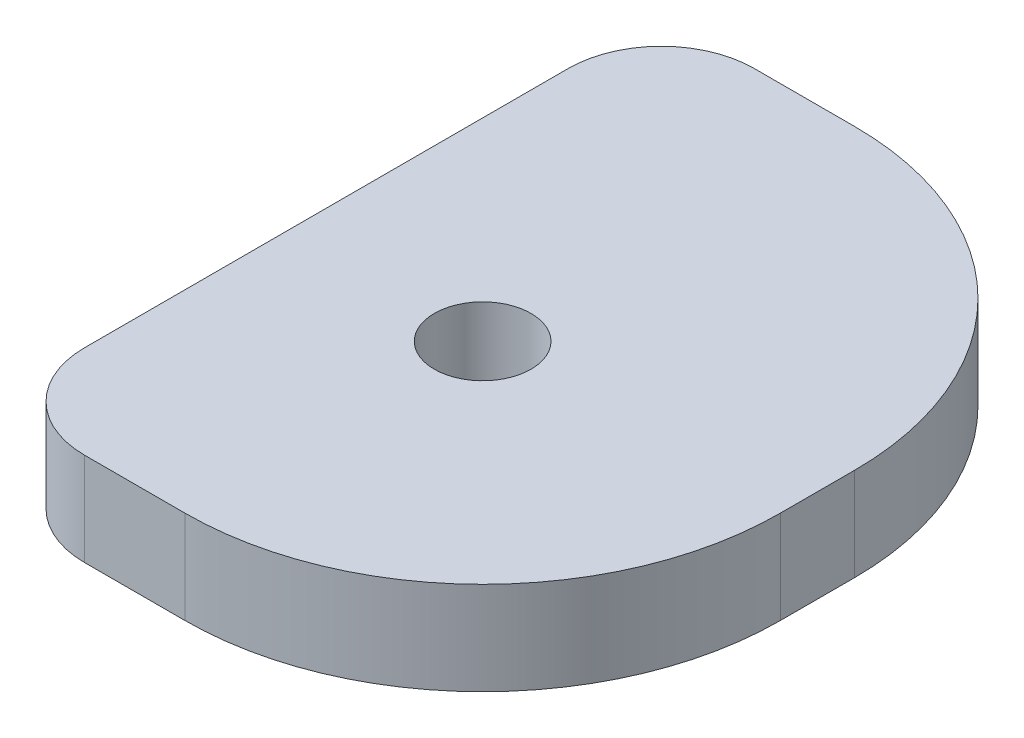
ISO-10303-21;
HEADER;
FILE_DESCRIPTION(('STEP AP214'),'2;1');
FILE_NAME('part.step','',(''),(''),'','','');
FILE_SCHEMA(('AUTOMOTIVE_DESIGN { 1 0 10303 214 1 1 1 1 }'));
ENDSEC;
DATA;
#1=APPLICATION_CONTEXT('core data for automotive mechanical design processes');
#2=APPLICATION_PROTOCOL_DEFINITION('international standard','automotive_design',2000,#1);
#3=PRODUCT_CONTEXT('',#1,'mechanical');
#4=PRODUCT('Part','Part','',(#3));
#5=PRODUCT_RELATED_PRODUCT_CATEGORY('part','',(#4));
#6=PRODUCT_DEFINITION_FORMATION('','',#4);
#7=PRODUCT_DEFINITION_CONTEXT('part definition',#1,'design');
#8=PRODUCT_DEFINITION('design','',#6,#7);
#9=PRODUCT_DEFINITION_SHAPE('','',#8);
#10=(LENGTH_UNIT() NAMED_UNIT(*) SI_UNIT(.MILLI.,.METRE.));
#11=(NAMED_UNIT(*) PLANE_ANGLE_UNIT() SI_UNIT($,.RADIAN.));
#12=(NAMED_UNIT(*) SI_UNIT($,.STERADIAN.) SOLID_ANGLE_UNIT());
#13=UNCERTAINTY_MEASURE_WITH_UNIT(LENGTH_MEASURE(1.E-05),#10,'distance_accuracy_value','');
#14=(GEOMETRIC_REPRESENTATION_CONTEXT(3) GLOBAL_UNCERTAINTY_ASSIGNED_CONTEXT((#13)) GLOBAL_UNIT_ASSIGNED_CONTEXT((#10,
#11,#12)) REPRESENTATION_CONTEXT('',''));
#15=CARTESIAN_POINT('',(0.,0.,0.));
#16=DIRECTION('',(0.,0.,1.));
#17=DIRECTION('',(1.,0.,0.));
#18=AXIS2_PLACEMENT_3D('',#15,#16,#17);
#19=CARTESIAN_POINT('',(-25.4,3.175,11.43));
#20=DIRECTION('',(0.,0.,-1.));
#21=DIRECTION('',(-1.,0.,0.));
#22=AXIS2_PLACEMENT_3D('',#19,#20,#21);
#23=PLANE('',#22);
#24=DIRECTION('',(1.,0.,0.));
#25=VECTOR('',#24,1.);
#26=CARTESIAN_POINT('',(-25.4,3.175,11.43));
#27=LINE('',#26,#25);
#28=CARTESIAN_POINT('',(11.811,3.175,11.43));
#29=VERTEX_POINT('',#28);
#30=CARTESIAN_POINT('',(15.24,3.175,11.43));
#31=VERTEX_POINT('',#30);
#32=EDGE_CURVE('E156',#29,#31,#27,.T.);
#33=ORIENTED_EDGE('',*,*,#32,.F.);
#34=DIRECTION('',(0.,-1.,0.));
#35=VECTOR('',#34,1.);
#36=CARTESIAN_POINT('',(11.811,3.175,11.43));
#37=LINE('',#36,#35);
#38=CARTESIAN_POINT('',(11.811,0.,11.43));
#39=VERTEX_POINT('',#38);
#40=EDGE_CURVE('E107',#29,#39,#37,.T.);
#41=ORIENTED_EDGE('',*,*,#40,.T.);
#42=DIRECTION('',(1.,0.,0.));
#43=VECTOR('',#42,1.);
#44=CARTESIAN_POINT('',(-25.4,0.,11.43));
#45=LINE('',#44,#43);
#46=CARTESIAN_POINT('',(15.24,0.,11.43));
#47=VERTEX_POINT('',#46);
#48=EDGE_CURVE('E100',#39,#47,#45,.T.);
#49=ORIENTED_EDGE('',*,*,#48,.T.);
#50=DIRECTION('',(0.,-1.,0.));
#51=VECTOR('',#50,1.);
#52=CARTESIAN_POINT('',(15.24,3.175,11.43));
#53=LINE('',#52,#51);
#54=EDGE_CURVE('E104',#47,#31,#53,.F.);
#55=ORIENTED_EDGE('',*,*,#54,.T.);
#56=EDGE_LOOP('',(#33,#41,#49,#55));
#57=FACE_BOUND('',#56,.T.);
#58=ADVANCED_FACE('F32',(#57),#23,.F.);
#59=CARTESIAN_POINT('',(25.4,3.175,-11.43));
#60=DIRECTION('',(-1.,0.,0.));
#61=DIRECTION('',(0.,0.,1.));
#62=AXIS2_PLACEMENT_3D('',#59,#60,#61);
#63=PLANE('',#62);
#64=DIRECTION('',(0.,0.,-1.));
#65=VECTOR('',#64,1.);
#66=CARTESIAN_POINT('',(25.4,0.,-11.43));
#67=LINE('',#66,#65);
#68=CARTESIAN_POINT('',(25.4,0.,1.27));
#69=VERTEX_POINT('',#68);
#70=CARTESIAN_POINT('',(25.4,0.,-1.27));
#71=VERTEX_POINT('',#70);
#72=EDGE_CURVE('E109',#69,#71,#67,.T.);
#73=ORIENTED_EDGE('',*,*,#72,.T.);
#74=DIRECTION('',(0.,-1.,0.));
#75=VECTOR('',#74,1.);
#76=CARTESIAN_POINT('',(25.4,3.175,-1.27));
#77=LINE('',#76,#75);
#78=CARTESIAN_POINT('',(25.4,3.175,-1.27));
#79=VERTEX_POINT('',#78);
#80=EDGE_CURVE('E140',#71,#79,#77,.F.);
#81=ORIENTED_EDGE('',*,*,#80,.T.);
#82=DIRECTION('',(0.,0.,-1.));
#83=VECTOR('',#82,1.);
#84=CARTESIAN_POINT('',(25.4,3.175,-11.43));
#85=LINE('',#84,#83);
#86=CARTESIAN_POINT('',(25.4,3.175,1.27));
#87=VERTEX_POINT('',#86);
#88=EDGE_CURVE('E124',#87,#79,#85,.T.);
#89=ORIENTED_EDGE('',*,*,#88,.F.);
#90=DIRECTION('',(0.,-1.,0.));
#91=VECTOR('',#90,1.);
#92=CARTESIAN_POINT('',(25.4,3.175,1.27));
#93=LINE('',#92,#91);
#94=EDGE_CURVE('E131',#87,#69,#93,.T.);
#95=ORIENTED_EDGE('',*,*,#94,.T.);
#96=EDGE_LOOP('',(#73,#81,#89,#95));
#97=FACE_BOUND('',#96,.T.);
#98=ADVANCED_FACE('F185',(#97),#63,.F.);
#99=CARTESIAN_POINT('',(-25.4,3.175,-11.43));
#100=DIRECTION('',(0.,0.,1.));
#101=DIRECTION('',(1.,0.,0.));
#102=AXIS2_PLACEMENT_3D('',#99,#100,#101);
#103=PLANE('',#102);
#104=DIRECTION('',(-1.,0.,0.));
#105=VECTOR('',#104,1.);
#106=CARTESIAN_POINT('',(-25.4,0.,-11.43));
#107=LINE('',#106,#105);
#108=CARTESIAN_POINT('',(15.24,0.,-11.43));
#109=VERTEX_POINT('',#108);
#110=CARTESIAN_POINT('',(11.811,0.,-11.43));
#111=VERTEX_POINT('',#110);
#112=EDGE_CURVE('E127',#109,#111,#107,.T.);
#113=ORIENTED_EDGE('',*,*,#112,.T.);
#114=DIRECTION('',(0.,-1.,0.));
#115=VECTOR('',#114,1.);
#116=CARTESIAN_POINT('',(11.811,3.175,-11.43));
#117=LINE('',#116,#115);
#118=CARTESIAN_POINT('',(11.811,3.175,-11.43));
#119=VERTEX_POINT('',#118);
#120=EDGE_CURVE('E11',#111,#119,#117,.F.);
#121=ORIENTED_EDGE('',*,*,#120,.T.);
#122=DIRECTION('',(-1.,0.,0.));
#123=VECTOR('',#122,1.);
#124=CARTESIAN_POINT('',(-25.4,3.175,-11.43));
#125=LINE('',#124,#123);
#126=CARTESIAN_POINT('',(15.24,3.175,-11.43));
#127=VERTEX_POINT('',#126);
#128=EDGE_CURVE('E122',#127,#119,#125,.T.);
#129=ORIENTED_EDGE('',*,*,#128,.F.);
#130=DIRECTION('',(0.,-1.,0.));
#131=VECTOR('',#130,1.);
#132=CARTESIAN_POINT('',(15.24,3.175,-11.43));
#133=LINE('',#132,#131);
#134=EDGE_CURVE('E135',#127,#109,#133,.T.);
#135=ORIENTED_EDGE('',*,*,#134,.T.);
#136=EDGE_LOOP('',(#113,#121,#129,#135));
#137=FACE_BOUND('',#136,.T.);
#138=ADVANCED_FACE('F177',(#137),#103,.F.);
#139=CARTESIAN_POINT('',(0.,3.175,0.));
#140=DIRECTION('',(0.,1.,0.));
#141=DIRECTION('',(0.,0.,1.));
#142=AXIS2_PLACEMENT_3D('',#139,#140,#141);
#143=PLANE('',#142);
#144=DIRECTION('',(0.,0.,1.));
#145=VECTOR('',#144,1.);
#146=CARTESIAN_POINT('',(8.63599999999999,3.175,11.43));
#147=LINE('',#146,#145);
#148=CARTESIAN_POINT('',(8.63599999999999,3.175,-8.255));
#149=VERTEX_POINT('',#148);
#150=CARTESIAN_POINT('',(8.63599999999999,3.175,8.255));
#151=VERTEX_POINT('',#150);
#152=EDGE_CURVE('E157',#149,#151,#147,.T.);
#153=ORIENTED_EDGE('',*,*,#152,.T.);
#154=CARTESIAN_POINT('',(11.811,3.175,8.255));
#155=DIRECTION('',(0.,1.,0.));
#156=DIRECTION('',(0.,0.,1.));
#157=AXIS2_PLACEMENT_3D('',#154,#155,#156);
#158=CIRCLE('',#157,3.175);
#159=EDGE_CURVE('E40',#151,#29,#158,.T.);
#160=ORIENTED_EDGE('',*,*,#159,.T.);
#161=ORIENTED_EDGE('',*,*,#32,.T.);
#162=CARTESIAN_POINT('',(15.24,3.175,1.27));
#163=DIRECTION('',(0.,1.,0.));
#164=DIRECTION('',(0.,0.,1.));
#165=AXIS2_PLACEMENT_3D('',#162,#163,#164);
#166=CIRCLE('',#165,10.16);
#167=EDGE_CURVE('E119',#31,#87,#166,.T.);
#168=ORIENTED_EDGE('',*,*,#167,.T.);
#169=ORIENTED_EDGE('',*,*,#88,.T.);
#170=CARTESIAN_POINT('',(15.24,3.175,-1.27));
#171=DIRECTION('',(0.,1.,0.));
#172=DIRECTION('',(0.,0.,1.));
#173=AXIS2_PLACEMENT_3D('',#170,#171,#172);
#174=CIRCLE('',#173,10.16);
#175=EDGE_CURVE('E138',#79,#127,#174,.T.);
#176=ORIENTED_EDGE('',*,*,#175,.T.);
#177=ORIENTED_EDGE('',*,*,#128,.T.);
#178=CARTESIAN_POINT('',(11.811,3.175,-8.255));
#179=DIRECTION('',(0.,1.,0.));
#180=DIRECTION('',(0.,0.,1.));
#181=AXIS2_PLACEMENT_3D('',#178,#179,#180);
#182=CIRCLE('',#181,3.175);
#183=EDGE_CURVE('E151',#119,#149,#182,.T.);
#184=ORIENTED_EDGE('',*,*,#183,.T.);
#185=EDGE_LOOP('',(#153,#160,#161,#168,#169,#176,#177,#184));
#186=FACE_BOUND('',#185,.T.);
#187=CARTESIAN_POINT('',(15.24,3.175,1.27));
#188=DIRECTION('',(0.,1.,0.));
#189=DIRECTION('',(0.,0.,1.));
#190=AXIS2_PLACEMENT_3D('',#187,#188,#189);
#191=CIRCLE('',#190,1.651);
#192=CARTESIAN_POINT('',(15.24,3.175,2.921));
#193=VERTEX_POINT('',#192);
#194=EDGE_CURVE('E166',#193,#193,#191,.T.);
#195=ORIENTED_EDGE('',*,*,#194,.F.);
#196=EDGE_LOOP('',(#195));
#197=FACE_BOUND('',#196,.T.);
#198=ADVANCED_FACE('F154',(#186,#197),#143,.T.);
#199=CARTESIAN_POINT('',(0.,0.,0.));
#200=DIRECTION('',(0.,1.,0.));
#201=DIRECTION('',(0.,0.,1.));
#202=AXIS2_PLACEMENT_3D('',#199,#200,#201);
#203=PLANE('',#202);
#204=CARTESIAN_POINT('',(15.24,0.,1.27));
#205=DIRECTION('',(0.,1.,0.));
#206=DIRECTION('',(0.,0.,1.));
#207=AXIS2_PLACEMENT_3D('',#204,#205,#206);
#208=CIRCLE('',#207,1.651);
#209=CARTESIAN_POINT('',(15.24,0.,2.921));
#210=VERTEX_POINT('',#209);
#211=EDGE_CURVE('E110',#210,#210,#208,.T.);
#212=ORIENTED_EDGE('',*,*,#211,.T.);
#213=EDGE_LOOP('',(#212));
#214=FACE_BOUND('',#213,.T.);
#215=ORIENTED_EDGE('',*,*,#48,.F.);
#216=CARTESIAN_POINT('',(11.811,0.,8.255));
#217=DIRECTION('',(0.,1.,0.));
#218=DIRECTION('',(0.,0.,1.));
#219=AXIS2_PLACEMENT_3D('',#216,#217,#218);
#220=CIRCLE('',#219,3.175);
#221=CARTESIAN_POINT('',(8.63599999999999,0.,8.255));
#222=VERTEX_POINT('',#221);
#223=EDGE_CURVE('E145',#39,#222,#220,.F.);
#224=ORIENTED_EDGE('',*,*,#223,.T.);
#225=DIRECTION('',(0.,0.,1.));
#226=VECTOR('',#225,1.);
#227=CARTESIAN_POINT('',(8.63599999999999,0.,11.43));
#228=LINE('',#227,#226);
#229=CARTESIAN_POINT('',(8.63599999999999,0.,-8.255));
#230=VERTEX_POINT('',#229);
#231=EDGE_CURVE('E162',#230,#222,#228,.T.);
#232=ORIENTED_EDGE('',*,*,#231,.F.);
#233=CARTESIAN_POINT('',(11.811,0.,-8.255));
#234=DIRECTION('',(0.,1.,0.));
#235=DIRECTION('',(0.,0.,1.));
#236=AXIS2_PLACEMENT_3D('',#233,#234,#235);
#237=CIRCLE('',#236,3.175);
#238=EDGE_CURVE('E143',#230,#111,#237,.F.);
#239=ORIENTED_EDGE('',*,*,#238,.T.);
#240=ORIENTED_EDGE('',*,*,#112,.F.);
#241=CARTESIAN_POINT('',(15.24,0.,-1.27));
#242=DIRECTION('',(0.,1.,0.));
#243=DIRECTION('',(0.,0.,1.));
#244=AXIS2_PLACEMENT_3D('',#241,#242,#243);
#245=CIRCLE('',#244,10.16);
#246=EDGE_CURVE('E133',#109,#71,#245,.F.);
#247=ORIENTED_EDGE('',*,*,#246,.T.);
#248=ORIENTED_EDGE('',*,*,#72,.F.);
#249=CARTESIAN_POINT('',(15.24,0.,1.27));
#250=DIRECTION('',(0.,1.,0.));
#251=DIRECTION('',(0.,0.,1.));
#252=AXIS2_PLACEMENT_3D('',#249,#250,#251);
#253=CIRCLE('',#252,10.16);
#254=EDGE_CURVE('E113',#69,#47,#253,.F.);
#255=ORIENTED_EDGE('',*,*,#254,.T.);
#256=EDGE_LOOP('',(#215,#224,#232,#239,#240,#247,#248,#255));
#257=FACE_BOUND('',#256,.T.);
#258=ADVANCED_FACE('F114',(#214,#257),#203,.F.);
#259=CARTESIAN_POINT('',(15.24,3.175,1.27));
#260=DIRECTION('',(0.,-1.,0.));
#261=DIRECTION('',(0.,0.,-1.));
#262=AXIS2_PLACEMENT_3D('',#259,#260,#261);
#263=CYLINDRICAL_SURFACE('',#262,10.16);
#264=ORIENTED_EDGE('',*,*,#167,.F.);
#265=ORIENTED_EDGE('',*,*,#54,.F.);
#266=ORIENTED_EDGE('',*,*,#254,.F.);
#267=ORIENTED_EDGE('',*,*,#94,.F.);
#268=EDGE_LOOP('',(#264,#265,#266,#267));
#269=FACE_BOUND('',#268,.T.);
#270=ADVANCED_FACE('F121',(#269),#263,.T.);
#271=CARTESIAN_POINT('',(15.24,0.,1.27));
#272=DIRECTION('',(0.,1.,0.));
#273=DIRECTION('',(0.,0.,1.));
#274=AXIS2_PLACEMENT_3D('',#271,#272,#273);
#275=CYLINDRICAL_SURFACE('',#274,1.651);
#276=ORIENTED_EDGE('',*,*,#211,.F.);
#277=EDGE_LOOP('',(#276));
#278=FACE_BOUND('',#277,.T.);
#279=ORIENTED_EDGE('',*,*,#194,.T.);
#280=EDGE_LOOP('',(#279));
#281=FACE_BOUND('',#280,.T.);
#282=ADVANCED_FACE('F198',(#278,#281),#275,.F.);
#283=CARTESIAN_POINT('',(15.24,3.175,-1.27));
#284=DIRECTION('',(0.,-1.,0.));
#285=DIRECTION('',(0.,0.,-1.));
#286=AXIS2_PLACEMENT_3D('',#283,#284,#285);
#287=CYLINDRICAL_SURFACE('',#286,10.16);
#288=ORIENTED_EDGE('',*,*,#175,.F.);
#289=ORIENTED_EDGE('',*,*,#80,.F.);
#290=ORIENTED_EDGE('',*,*,#246,.F.);
#291=ORIENTED_EDGE('',*,*,#134,.F.);
#292=EDGE_LOOP('',(#288,#289,#290,#291));
#293=FACE_BOUND('',#292,.T.);
#294=ADVANCED_FACE('F183',(#293),#287,.T.);
#295=CARTESIAN_POINT('',(8.63599999999999,3.175,11.43));
#296=DIRECTION('',(1.,0.,0.));
#297=DIRECTION('',(0.,0.,-1.));
#298=AXIS2_PLACEMENT_3D('',#295,#296,#297);
#299=PLANE('',#298);
#300=ORIENTED_EDGE('',*,*,#231,.T.);
#301=DIRECTION('',(0.,-1.,0.));
#302=VECTOR('',#301,1.);
#303=CARTESIAN_POINT('',(8.63599999999999,3.175,8.255));
#304=LINE('',#303,#302);
#305=EDGE_CURVE('E53',#222,#151,#304,.F.);
#306=ORIENTED_EDGE('',*,*,#305,.T.);
#307=ORIENTED_EDGE('',*,*,#152,.F.);
#308=DIRECTION('',(0.,-1.,0.));
#309=VECTOR('',#308,1.);
#310=CARTESIAN_POINT('',(8.63599999999999,3.175,-8.255));
#311=LINE('',#310,#309);
#312=EDGE_CURVE('E147',#149,#230,#311,.T.);
#313=ORIENTED_EDGE('',*,*,#312,.T.);
#314=EDGE_LOOP('',(#300,#306,#307,#313));
#315=FACE_BOUND('',#314,.T.);
#316=ADVANCED_FACE('F163',(#315),#299,.F.);
#317=CARTESIAN_POINT('',(11.811,3.175,8.255));
#318=DIRECTION('',(0.,-1.,0.));
#319=DIRECTION('',(0.,0.,-1.));
#320=AXIS2_PLACEMENT_3D('',#317,#318,#319);
#321=CYLINDRICAL_SURFACE('',#320,3.175);
#322=ORIENTED_EDGE('',*,*,#159,.F.);
#323=ORIENTED_EDGE('',*,*,#305,.F.);
#324=ORIENTED_EDGE('',*,*,#223,.F.);
#325=ORIENTED_EDGE('',*,*,#40,.F.);
#326=EDGE_LOOP('',(#322,#323,#324,#325));
#327=FACE_BOUND('',#326,.T.);
#328=ADVANCED_FACE('F160',(#327),#321,.T.);
#329=CARTESIAN_POINT('',(11.811,3.175,-8.255));
#330=DIRECTION('',(0.,-1.,0.));
#331=DIRECTION('',(0.,0.,-1.));
#332=AXIS2_PLACEMENT_3D('',#329,#330,#331);
#333=CYLINDRICAL_SURFACE('',#332,3.175);
#334=ORIENTED_EDGE('',*,*,#183,.F.);
#335=ORIENTED_EDGE('',*,*,#120,.F.);
#336=ORIENTED_EDGE('',*,*,#238,.F.);
#337=ORIENTED_EDGE('',*,*,#312,.F.);
#338=EDGE_LOOP('',(#334,#335,#336,#337));
#339=FACE_BOUND('',#338,.T.);
#340=ADVANCED_FACE('F34',(#339),#333,.T.);
#341=CLOSED_SHELL('',(#58,#98,#138,#198,#258,#270,#282,#294,#316,#328,#340));
#342=MANIFOLD_SOLID_BREP('B2',#341);
#343=ADVANCED_BREP_SHAPE_REPRESENTATION('',(#18,#342),#14);
#344=SHAPE_DEFINITION_REPRESENTATION(#9,#343);
ENDSEC;
END-ISO-10303-21;
